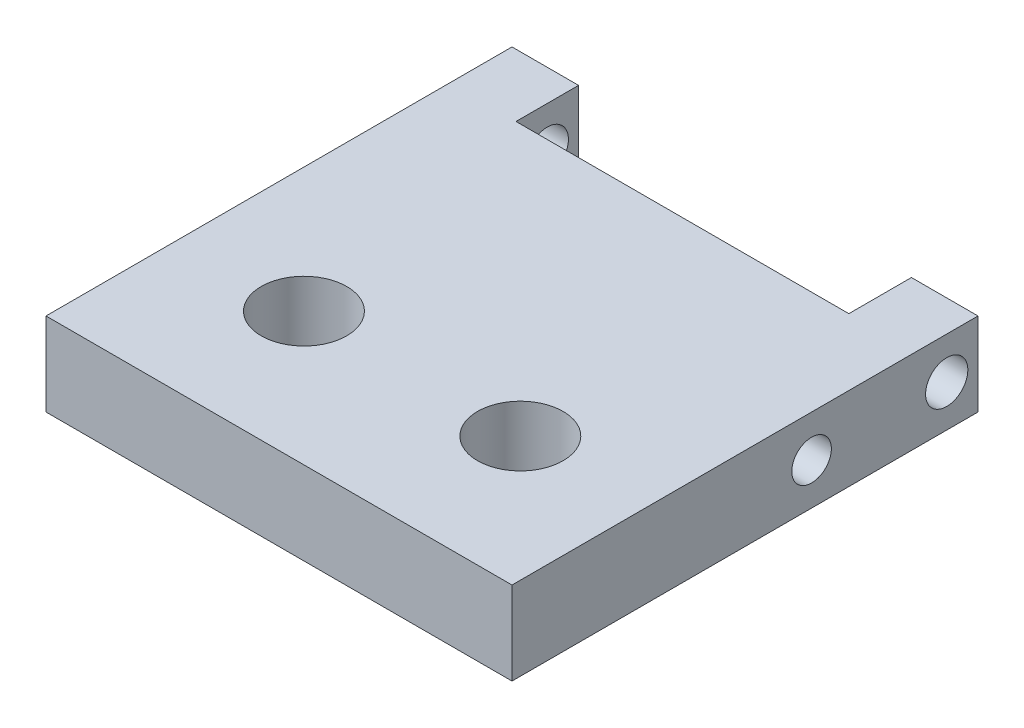
ISO-10303-21;
HEADER;
FILE_DESCRIPTION(('STEP AP214'),'2;1');
FILE_NAME('part.step','',(''),(''),'','','');
FILE_SCHEMA(('AUTOMOTIVE_DESIGN { 1 0 10303 214 1 1 1 1 }'));
ENDSEC;
DATA;
#1=APPLICATION_CONTEXT('core data for automotive mechanical design processes');
#2=APPLICATION_PROTOCOL_DEFINITION('international standard','automotive_design',2000,#1);
#3=PRODUCT_CONTEXT('',#1,'mechanical');
#4=PRODUCT('Part','Part','',(#3));
#5=PRODUCT_RELATED_PRODUCT_CATEGORY('part','',(#4));
#6=PRODUCT_DEFINITION_FORMATION('','',#4);
#7=PRODUCT_DEFINITION_CONTEXT('part definition',#1,'design');
#8=PRODUCT_DEFINITION('design','',#6,#7);
#9=PRODUCT_DEFINITION_SHAPE('','',#8);
#10=(LENGTH_UNIT() NAMED_UNIT(*) SI_UNIT(.MILLI.,.METRE.));
#11=(NAMED_UNIT(*) PLANE_ANGLE_UNIT() SI_UNIT($,.RADIAN.));
#12=(NAMED_UNIT(*) SI_UNIT($,.STERADIAN.) SOLID_ANGLE_UNIT());
#13=UNCERTAINTY_MEASURE_WITH_UNIT(LENGTH_MEASURE(1.E-05),#10,'distance_accuracy_value','');
#14=(GEOMETRIC_REPRESENTATION_CONTEXT(3) GLOBAL_UNCERTAINTY_ASSIGNED_CONTEXT((#13)) GLOBAL_UNIT_ASSIGNED_CONTEXT((#10,
#11,#12)) REPRESENTATION_CONTEXT('',''));
#15=CARTESIAN_POINT('',(0.,0.,0.));
#16=DIRECTION('',(0.,0.,1.));
#17=DIRECTION('',(1.,0.,0.));
#18=AXIS2_PLACEMENT_3D('',#15,#16,#17);
#19=CARTESIAN_POINT('',(-8.89,3.175,-8.89));
#20=DIRECTION('',(0.,0.,1.));
#21=DIRECTION('',(1.,0.,0.));
#22=AXIS2_PLACEMENT_3D('',#19,#20,#21);
#23=PLANE('',#22);
#24=DIRECTION('',(0.,-1.,0.));
#25=VECTOR('',#24,1.);
#26=CARTESIAN_POINT('',(6.34999999999999,3.175,-8.89));
#27=LINE('',#26,#25);
#28=CARTESIAN_POINT('',(6.34999999999999,3.175,-8.89));
#29=VERTEX_POINT('',#28);
#30=CARTESIAN_POINT('',(6.34999999999999,0.,-8.89));
#31=VERTEX_POINT('',#30);
#32=EDGE_CURVE('E155',#29,#31,#27,.T.);
#33=ORIENTED_EDGE('',*,*,#32,.F.);
#34=DIRECTION('',(-1.,0.,0.));
#35=VECTOR('',#34,1.);
#36=CARTESIAN_POINT('',(-8.89,3.175,-8.89));
#37=LINE('',#36,#35);
#38=CARTESIAN_POINT('',(8.89,3.175,-8.89));
#39=VERTEX_POINT('',#38);
#40=EDGE_CURVE('E88',#39,#29,#37,.T.);
#41=ORIENTED_EDGE('',*,*,#40,.F.);
#42=DIRECTION('',(0.,-1.,0.));
#43=VECTOR('',#42,1.);
#44=CARTESIAN_POINT('',(8.89,3.175,-8.89));
#45=LINE('',#44,#43);
#46=CARTESIAN_POINT('',(8.89,0.,-8.89));
#47=VERTEX_POINT('',#46);
#48=EDGE_CURVE('E151',#39,#47,#45,.T.);
#49=ORIENTED_EDGE('',*,*,#48,.T.);
#50=DIRECTION('',(-1.,0.,0.));
#51=VECTOR('',#50,1.);
#52=CARTESIAN_POINT('',(-8.89,0.,-8.89));
#53=LINE('',#52,#51);
#54=EDGE_CURVE('E133',#47,#31,#53,.T.);
#55=ORIENTED_EDGE('',*,*,#54,.T.);
#56=EDGE_LOOP('',(#33,#41,#49,#55));
#57=FACE_BOUND('',#56,.T.);
#58=ADVANCED_FACE('F34',(#57),#23,.F.);
#59=CARTESIAN_POINT('',(8.89,3.175,8.89));
#60=DIRECTION('',(-1.,0.,0.));
#61=DIRECTION('',(0.,0.,1.));
#62=AXIS2_PLACEMENT_3D('',#59,#60,#61);
#63=PLANE('',#62);
#64=CARTESIAN_POINT('',(8.89,1.5875,-2.54));
#65=DIRECTION('',(1.,0.,0.));
#66=DIRECTION('',(0.,0.,-1.));
#67=AXIS2_PLACEMENT_3D('',#64,#65,#66);
#68=CIRCLE('',#67,0.755649999999988);
#69=CARTESIAN_POINT('',(8.89,1.5875,-3.29564999999999));
#70=VERTEX_POINT('',#69);
#71=EDGE_CURVE('E199',#70,#70,#68,.T.);
#72=ORIENTED_EDGE('',*,*,#71,.F.);
#73=EDGE_LOOP('',(#72));
#74=FACE_BOUND('',#73,.T.);
#75=CARTESIAN_POINT('',(8.89,1.5875,-7.6962));
#76=DIRECTION('',(1.,0.,0.));
#77=DIRECTION('',(0.,0.,-1.));
#78=AXIS2_PLACEMENT_3D('',#75,#76,#77);
#79=CIRCLE('',#78,0.806449999999998);
#80=CARTESIAN_POINT('',(8.89,1.5875,-8.50265));
#81=VERTEX_POINT('',#80);
#82=EDGE_CURVE('E193',#81,#81,#79,.T.);
#83=ORIENTED_EDGE('',*,*,#82,.F.);
#84=EDGE_LOOP('',(#83));
#85=FACE_BOUND('',#84,.T.);
#86=DIRECTION('',(0.,0.,-1.));
#87=VECTOR('',#86,1.);
#88=CARTESIAN_POINT('',(8.89,0.,8.89));
#89=LINE('',#88,#87);
#90=CARTESIAN_POINT('',(8.89,0.,8.89));
#91=VERTEX_POINT('',#90);
#92=EDGE_CURVE('E134',#91,#47,#89,.T.);
#93=ORIENTED_EDGE('',*,*,#92,.T.);
#94=ORIENTED_EDGE('',*,*,#48,.F.);
#95=DIRECTION('',(0.,0.,-1.));
#96=VECTOR('',#95,1.);
#97=CARTESIAN_POINT('',(8.89,3.175,8.89));
#98=LINE('',#97,#96);
#99=CARTESIAN_POINT('',(8.89,3.175,8.89));
#100=VERTEX_POINT('',#99);
#101=EDGE_CURVE('E144',#100,#39,#98,.T.);
#102=ORIENTED_EDGE('',*,*,#101,.F.);
#103=DIRECTION('',(0.,-1.,0.));
#104=VECTOR('',#103,1.);
#105=CARTESIAN_POINT('',(8.89,3.175,8.89));
#106=LINE('',#105,#104);
#107=EDGE_CURVE('E145',#100,#91,#106,.T.);
#108=ORIENTED_EDGE('',*,*,#107,.T.);
#109=EDGE_LOOP('',(#93,#94,#102,#108));
#110=FACE_BOUND('',#109,.T.);
#111=ADVANCED_FACE('F36',(#74,#85,#110),#63,.F.);
#112=CARTESIAN_POINT('',(-6.35,3.175,-8.89));
#113=VERTEX_POINT('',#112);
#114=CARTESIAN_POINT('',(-8.89,3.175,-8.89));
#115=VERTEX_POINT('',#114);
#116=EDGE_CURVE('E165',#113,#115,#37,.T.);
#117=ORIENTED_EDGE('',*,*,#116,.F.);
#118=DIRECTION('',(0.,-1.,0.));
#119=VECTOR('',#118,1.);
#120=CARTESIAN_POINT('',(-6.35,3.175,-8.89));
#121=LINE('',#120,#119);
#122=CARTESIAN_POINT('',(-6.35,0.,-8.89));
#123=VERTEX_POINT('',#122);
#124=EDGE_CURVE('E138',#113,#123,#121,.T.);
#125=ORIENTED_EDGE('',*,*,#124,.T.);
#126=CARTESIAN_POINT('',(-8.89,0.,-8.89));
#127=VERTEX_POINT('',#126);
#128=EDGE_CURVE('E128',#123,#127,#53,.T.);
#129=ORIENTED_EDGE('',*,*,#128,.T.);
#130=DIRECTION('',(0.,-1.,0.));
#131=VECTOR('',#130,1.);
#132=CARTESIAN_POINT('',(-8.89,3.175,-8.89));
#133=LINE('',#132,#131);
#134=EDGE_CURVE('E149',#115,#127,#133,.T.);
#135=ORIENTED_EDGE('',*,*,#134,.F.);
#136=EDGE_LOOP('',(#117,#125,#129,#135));
#137=FACE_BOUND('',#136,.T.);
#138=ADVANCED_FACE('F207',(#137),#23,.F.);
#139=CARTESIAN_POINT('',(-8.89,3.175,8.89));
#140=DIRECTION('',(1.,0.,0.));
#141=DIRECTION('',(0.,0.,-1.));
#142=AXIS2_PLACEMENT_3D('',#139,#140,#141);
#143=PLANE('',#142);
#144=CARTESIAN_POINT('',(-8.89,1.5875,-2.54));
#145=DIRECTION('',(1.,0.,0.));
#146=DIRECTION('',(0.,0.,-1.));
#147=AXIS2_PLACEMENT_3D('',#144,#145,#146);
#148=CIRCLE('',#147,0.755649999999997);
#149=CARTESIAN_POINT('',(-8.89,1.5875,-3.29565));
#150=VERTEX_POINT('',#149);
#151=EDGE_CURVE('E196',#150,#150,#148,.T.);
#152=ORIENTED_EDGE('',*,*,#151,.T.);
#153=EDGE_LOOP('',(#152));
#154=FACE_BOUND('',#153,.T.);
#155=CARTESIAN_POINT('',(-8.89,1.5875,-7.6962));
#156=DIRECTION('',(1.,0.,0.));
#157=DIRECTION('',(0.,0.,-1.));
#158=AXIS2_PLACEMENT_3D('',#155,#156,#157);
#159=CIRCLE('',#158,0.806449999999995);
#160=CARTESIAN_POINT('',(-8.89,1.5875,-8.50264999999999));
#161=VERTEX_POINT('',#160);
#162=EDGE_CURVE('E190',#161,#161,#159,.T.);
#163=ORIENTED_EDGE('',*,*,#162,.T.);
#164=EDGE_LOOP('',(#163));
#165=FACE_BOUND('',#164,.T.);
#166=DIRECTION('',(0.,0.,1.));
#167=VECTOR('',#166,1.);
#168=CARTESIAN_POINT('',(-8.89,0.,8.89));
#169=LINE('',#168,#167);
#170=CARTESIAN_POINT('',(-8.89,0.,8.89));
#171=VERTEX_POINT('',#170);
#172=EDGE_CURVE('E129',#127,#171,#169,.T.);
#173=ORIENTED_EDGE('',*,*,#172,.T.);
#174=DIRECTION('',(0.,-1.,0.));
#175=VECTOR('',#174,1.);
#176=CARTESIAN_POINT('',(-8.89,3.175,8.89));
#177=LINE('',#176,#175);
#178=CARTESIAN_POINT('',(-8.89,3.175,8.89));
#179=VERTEX_POINT('',#178);
#180=EDGE_CURVE('E147',#179,#171,#177,.T.);
#181=ORIENTED_EDGE('',*,*,#180,.F.);
#182=DIRECTION('',(0.,0.,1.));
#183=VECTOR('',#182,1.);
#184=CARTESIAN_POINT('',(-8.89,3.175,8.89));
#185=LINE('',#184,#183);
#186=EDGE_CURVE('E161',#115,#179,#185,.T.);
#187=ORIENTED_EDGE('',*,*,#186,.F.);
#188=ORIENTED_EDGE('',*,*,#134,.T.);
#189=EDGE_LOOP('',(#173,#181,#187,#188));
#190=FACE_BOUND('',#189,.T.);
#191=ADVANCED_FACE('F231',(#154,#165,#190),#143,.F.);
#192=CARTESIAN_POINT('',(-8.89,3.175,8.89));
#193=DIRECTION('',(0.,0.,-1.));
#194=DIRECTION('',(-1.,0.,0.));
#195=AXIS2_PLACEMENT_3D('',#192,#193,#194);
#196=PLANE('',#195);
#197=DIRECTION('',(1.,0.,0.));
#198=VECTOR('',#197,1.);
#199=CARTESIAN_POINT('',(-8.89,0.,8.89));
#200=LINE('',#199,#198);
#201=EDGE_CURVE('E80',#171,#91,#200,.T.);
#202=ORIENTED_EDGE('',*,*,#201,.T.);
#203=ORIENTED_EDGE('',*,*,#107,.F.);
#204=DIRECTION('',(1.,0.,0.));
#205=VECTOR('',#204,1.);
#206=CARTESIAN_POINT('',(-8.89,3.175,8.89));
#207=LINE('',#206,#205);
#208=EDGE_CURVE('E59',#179,#100,#207,.T.);
#209=ORIENTED_EDGE('',*,*,#208,.F.);
#210=ORIENTED_EDGE('',*,*,#180,.T.);
#211=EDGE_LOOP('',(#202,#203,#209,#210));
#212=FACE_BOUND('',#211,.T.);
#213=ADVANCED_FACE('F159',(#212),#196,.F.);
#214=CARTESIAN_POINT('',(0.,3.175,0.));
#215=DIRECTION('',(0.,-1.,0.));
#216=DIRECTION('',(0.,0.,-1.));
#217=AXIS2_PLACEMENT_3D('',#214,#215,#216);
#218=PLANE('',#217);
#219=CARTESIAN_POINT('',(4.1275,3.175,3.81));
#220=DIRECTION('',(0.,1.,0.));
#221=DIRECTION('',(0.,0.,1.));
#222=AXIS2_PLACEMENT_3D('',#219,#220,#221);
#223=CIRCLE('',#222,1.63195);
#224=CARTESIAN_POINT('',(4.1275,3.175,5.44195));
#225=VERTEX_POINT('',#224);
#226=EDGE_CURVE('E184',#225,#225,#223,.T.);
#227=ORIENTED_EDGE('',*,*,#226,.F.);
#228=EDGE_LOOP('',(#227));
#229=FACE_BOUND('',#228,.T.);
#230=CARTESIAN_POINT('',(-4.1275,3.175,3.81));
#231=DIRECTION('',(0.,1.,0.));
#232=DIRECTION('',(0.,0.,1.));
#233=AXIS2_PLACEMENT_3D('',#230,#231,#232);
#234=CIRCLE('',#233,1.63195);
#235=CARTESIAN_POINT('',(-4.1275,3.175,5.44195));
#236=VERTEX_POINT('',#235);
#237=EDGE_CURVE('E178',#236,#236,#234,.T.);
#238=ORIENTED_EDGE('',*,*,#237,.F.);
#239=EDGE_LOOP('',(#238));
#240=FACE_BOUND('',#239,.T.);
#241=DIRECTION('',(1.,0.,0.));
#242=VECTOR('',#241,1.);
#243=CARTESIAN_POINT('',(-6.35,3.175,-6.5024));
#244=LINE('',#243,#242);
#245=CARTESIAN_POINT('',(-6.35,3.175,-6.5024));
#246=VERTEX_POINT('',#245);
#247=CARTESIAN_POINT('',(6.34999999999999,3.175,-6.5024));
#248=VERTEX_POINT('',#247);
#249=EDGE_CURVE('E172',#246,#248,#244,.T.);
#250=ORIENTED_EDGE('',*,*,#249,.F.);
#251=DIRECTION('',(0.,0.,1.));
#252=VECTOR('',#251,1.);
#253=CARTESIAN_POINT('',(-6.35,3.175,-11.2776));
#254=LINE('',#253,#252);
#255=EDGE_CURVE('E115',#113,#246,#254,.T.);
#256=ORIENTED_EDGE('',*,*,#255,.F.);
#257=ORIENTED_EDGE('',*,*,#116,.T.);
#258=ORIENTED_EDGE('',*,*,#186,.T.);
#259=ORIENTED_EDGE('',*,*,#208,.T.);
#260=ORIENTED_EDGE('',*,*,#101,.T.);
#261=ORIENTED_EDGE('',*,*,#40,.T.);
#262=DIRECTION('',(0.,0.,1.));
#263=VECTOR('',#262,1.);
#264=CARTESIAN_POINT('',(6.34999999999999,3.175,-11.2776));
#265=LINE('',#264,#263);
#266=EDGE_CURVE('E123',#29,#248,#265,.T.);
#267=ORIENTED_EDGE('',*,*,#266,.T.);
#268=EDGE_LOOP('',(#250,#256,#257,#258,#259,#260,#261,#267));
#269=FACE_BOUND('',#268,.T.);
#270=ADVANCED_FACE('F238',(#229,#240,#269),#218,.F.);
#271=CARTESIAN_POINT('',(0.,0.,0.));
#272=DIRECTION('',(0.,-1.,0.));
#273=DIRECTION('',(0.,0.,-1.));
#274=AXIS2_PLACEMENT_3D('',#271,#272,#273);
#275=PLANE('',#274);
#276=CARTESIAN_POINT('',(4.1275,0.,3.81));
#277=DIRECTION('',(0.,1.,0.));
#278=DIRECTION('',(0.,0.,1.));
#279=AXIS2_PLACEMENT_3D('',#276,#277,#278);
#280=CIRCLE('',#279,1.63195);
#281=CARTESIAN_POINT('',(4.1275,0.,5.44195));
#282=VERTEX_POINT('',#281);
#283=EDGE_CURVE('E181',#282,#282,#280,.T.);
#284=ORIENTED_EDGE('',*,*,#283,.T.);
#285=EDGE_LOOP('',(#284));
#286=FACE_BOUND('',#285,.T.);
#287=CARTESIAN_POINT('',(-4.1275,0.,3.81));
#288=DIRECTION('',(0.,1.,0.));
#289=DIRECTION('',(0.,0.,1.));
#290=AXIS2_PLACEMENT_3D('',#287,#288,#289);
#291=CIRCLE('',#290,1.63195);
#292=CARTESIAN_POINT('',(-4.1275,0.,5.44195));
#293=VERTEX_POINT('',#292);
#294=EDGE_CURVE('E174',#293,#293,#291,.T.);
#295=ORIENTED_EDGE('',*,*,#294,.T.);
#296=EDGE_LOOP('',(#295));
#297=FACE_BOUND('',#296,.T.);
#298=DIRECTION('',(0.,0.,-1.));
#299=VECTOR('',#298,1.);
#300=CARTESIAN_POINT('',(-6.35,0.,0.));
#301=LINE('',#300,#299);
#302=CARTESIAN_POINT('',(-6.35,0.,-6.5024));
#303=VERTEX_POINT('',#302);
#304=EDGE_CURVE('E11',#303,#123,#301,.T.);
#305=ORIENTED_EDGE('',*,*,#304,.F.);
#306=DIRECTION('',(1.,0.,0.));
#307=VECTOR('',#306,1.);
#308=CARTESIAN_POINT('',(-6.35,0.,-6.5024));
#309=LINE('',#308,#307);
#310=CARTESIAN_POINT('',(6.34999999999999,0.,-6.5024));
#311=VERTEX_POINT('',#310);
#312=EDGE_CURVE('E117',#303,#311,#309,.T.);
#313=ORIENTED_EDGE('',*,*,#312,.T.);
#314=DIRECTION('',(0.,0.,-1.));
#315=VECTOR('',#314,1.);
#316=CARTESIAN_POINT('',(6.34999999999999,0.,0.));
#317=LINE('',#316,#315);
#318=EDGE_CURVE('E43',#311,#31,#317,.T.);
#319=ORIENTED_EDGE('',*,*,#318,.T.);
#320=ORIENTED_EDGE('',*,*,#54,.F.);
#321=ORIENTED_EDGE('',*,*,#92,.F.);
#322=ORIENTED_EDGE('',*,*,#201,.F.);
#323=ORIENTED_EDGE('',*,*,#172,.F.);
#324=ORIENTED_EDGE('',*,*,#128,.F.);
#325=EDGE_LOOP('',(#305,#313,#319,#320,#321,#322,#323,#324));
#326=FACE_BOUND('',#325,.T.);
#327=ADVANCED_FACE('F126',(#286,#297,#326),#275,.T.);
#328=CARTESIAN_POINT('',(-6.35,0.,-11.2776));
#329=DIRECTION('',(-1.,0.,0.));
#330=DIRECTION('',(0.,0.,1.));
#331=AXIS2_PLACEMENT_3D('',#328,#329,#330);
#332=PLANE('',#331);
#333=CARTESIAN_POINT('',(-6.35,1.5875,-7.6962));
#334=DIRECTION('',(-1.,0.,0.));
#335=DIRECTION('',(0.,0.,1.));
#336=AXIS2_PLACEMENT_3D('',#333,#334,#335);
#337=CIRCLE('',#336,0.806449999999997);
#338=CARTESIAN_POINT('',(-6.35,1.5875,-6.88975));
#339=VERTEX_POINT('',#338);
#340=EDGE_CURVE('E187',#339,#339,#337,.T.);
#341=ORIENTED_EDGE('',*,*,#340,.T.);
#342=EDGE_LOOP('',(#341));
#343=FACE_BOUND('',#342,.T.);
#344=ORIENTED_EDGE('',*,*,#255,.T.);
#345=DIRECTION('',(0.,1.,0.));
#346=VECTOR('',#345,1.);
#347=CARTESIAN_POINT('',(-6.35,0.,-6.5024));
#348=LINE('',#347,#346);
#349=EDGE_CURVE('E110',#303,#246,#348,.T.);
#350=ORIENTED_EDGE('',*,*,#349,.F.);
#351=ORIENTED_EDGE('',*,*,#304,.T.);
#352=ORIENTED_EDGE('',*,*,#124,.F.);
#353=EDGE_LOOP('',(#344,#350,#351,#352));
#354=FACE_BOUND('',#353,.T.);
#355=ADVANCED_FACE('F111',(#343,#354),#332,.F.);
#356=CARTESIAN_POINT('',(6.34999999999999,0.,-11.2776));
#357=DIRECTION('',(-1.,0.,0.));
#358=DIRECTION('',(0.,0.,1.));
#359=AXIS2_PLACEMENT_3D('',#356,#357,#358);
#360=PLANE('',#359);
#361=CARTESIAN_POINT('',(6.34999999999999,1.5875,-7.6962));
#362=DIRECTION('',(-1.,0.,0.));
#363=DIRECTION('',(0.,0.,1.));
#364=AXIS2_PLACEMENT_3D('',#361,#362,#363);
#365=CIRCLE('',#364,0.806449999999997);
#366=CARTESIAN_POINT('',(6.34999999999999,1.5875,-6.88975));
#367=VERTEX_POINT('',#366);
#368=EDGE_CURVE('E38',#367,#367,#365,.T.);
#369=ORIENTED_EDGE('',*,*,#368,.F.);
#370=EDGE_LOOP('',(#369));
#371=FACE_BOUND('',#370,.T.);
#372=ORIENTED_EDGE('',*,*,#32,.T.);
#373=ORIENTED_EDGE('',*,*,#318,.F.);
#374=DIRECTION('',(0.,1.,0.));
#375=VECTOR('',#374,1.);
#376=CARTESIAN_POINT('',(6.34999999999999,0.,-6.5024));
#377=LINE('',#376,#375);
#378=EDGE_CURVE('E50',#311,#248,#377,.T.);
#379=ORIENTED_EDGE('',*,*,#378,.T.);
#380=ORIENTED_EDGE('',*,*,#266,.F.);
#381=EDGE_LOOP('',(#372,#373,#379,#380));
#382=FACE_BOUND('',#381,.T.);
#383=ADVANCED_FACE('F239',(#371,#382),#360,.T.);
#384=CARTESIAN_POINT('',(-6.35,0.,-6.5024));
#385=DIRECTION('',(0.,0.,1.));
#386=DIRECTION('',(1.,0.,0.));
#387=AXIS2_PLACEMENT_3D('',#384,#385,#386);
#388=PLANE('',#387);
#389=ORIENTED_EDGE('',*,*,#249,.T.);
#390=ORIENTED_EDGE('',*,*,#378,.F.);
#391=ORIENTED_EDGE('',*,*,#312,.F.);
#392=ORIENTED_EDGE('',*,*,#349,.T.);
#393=EDGE_LOOP('',(#389,#390,#391,#392));
#394=FACE_BOUND('',#393,.T.);
#395=ADVANCED_FACE('F120',(#394),#388,.F.);
#396=CARTESIAN_POINT('',(-4.1275,3.175,3.81));
#397=DIRECTION('',(0.,1.,0.));
#398=DIRECTION('',(0.,0.,1.));
#399=AXIS2_PLACEMENT_3D('',#396,#397,#398);
#400=CYLINDRICAL_SURFACE('',#399,1.63195);
#401=ORIENTED_EDGE('',*,*,#294,.F.);
#402=EDGE_LOOP('',(#401));
#403=FACE_BOUND('',#402,.T.);
#404=ORIENTED_EDGE('',*,*,#237,.T.);
#405=EDGE_LOOP('',(#404));
#406=FACE_BOUND('',#405,.T.);
#407=ADVANCED_FACE('F221',(#403,#406),#400,.F.);
#408=CARTESIAN_POINT('',(4.1275,3.175,3.81));
#409=DIRECTION('',(0.,1.,0.));
#410=DIRECTION('',(0.,0.,1.));
#411=AXIS2_PLACEMENT_3D('',#408,#409,#410);
#412=CYLINDRICAL_SURFACE('',#411,1.63195);
#413=ORIENTED_EDGE('',*,*,#283,.F.);
#414=EDGE_LOOP('',(#413));
#415=FACE_BOUND('',#414,.T.);
#416=ORIENTED_EDGE('',*,*,#226,.T.);
#417=EDGE_LOOP('',(#416));
#418=FACE_BOUND('',#417,.T.);
#419=ADVANCED_FACE('F213',(#415,#418),#412,.F.);
#420=CARTESIAN_POINT('',(8.89,1.5875,-7.6962));
#421=DIRECTION('',(1.,0.,0.));
#422=DIRECTION('',(0.,0.,-1.));
#423=AXIS2_PLACEMENT_3D('',#420,#421,#422);
#424=CYLINDRICAL_SURFACE('',#423,0.806449999999997);
#425=ORIENTED_EDGE('',*,*,#368,.T.);
#426=EDGE_LOOP('',(#425));
#427=FACE_BOUND('',#426,.T.);
#428=ORIENTED_EDGE('',*,*,#82,.T.);
#429=EDGE_LOOP('',(#428));
#430=FACE_BOUND('',#429,.T.);
#431=ADVANCED_FACE('F210',(#427,#430),#424,.F.);
#432=ORIENTED_EDGE('',*,*,#162,.F.);
#433=EDGE_LOOP('',(#432));
#434=FACE_BOUND('',#433,.T.);
#435=ORIENTED_EDGE('',*,*,#340,.F.);
#436=EDGE_LOOP('',(#435));
#437=FACE_BOUND('',#436,.T.);
#438=ADVANCED_FACE('F212',(#434,#437),#424,.F.);
#439=CARTESIAN_POINT('',(8.89,1.5875,-2.54));
#440=DIRECTION('',(1.,0.,0.));
#441=DIRECTION('',(0.,0.,-1.));
#442=AXIS2_PLACEMENT_3D('',#439,#440,#441);
#443=CYLINDRICAL_SURFACE('',#442,0.755649999999992);
#444=ORIENTED_EDGE('',*,*,#151,.F.);
#445=EDGE_LOOP('',(#444));
#446=FACE_BOUND('',#445,.T.);
#447=ORIENTED_EDGE('',*,*,#71,.T.);
#448=EDGE_LOOP('',(#447));
#449=FACE_BOUND('',#448,.T.);
#450=ADVANCED_FACE('F203',(#446,#449),#443,.F.);
#451=CLOSED_SHELL('',(#58,#111,#138,#191,#213,#270,#327,#355,#383,#395,#407,#419,#431,#438,#450));
#452=MANIFOLD_SOLID_BREP('B2',#451);
#453=ADVANCED_BREP_SHAPE_REPRESENTATION('',(#18,#452),#14);
#454=SHAPE_DEFINITION_REPRESENTATION(#9,#453);
ENDSEC;
END-ISO-10303-21;
